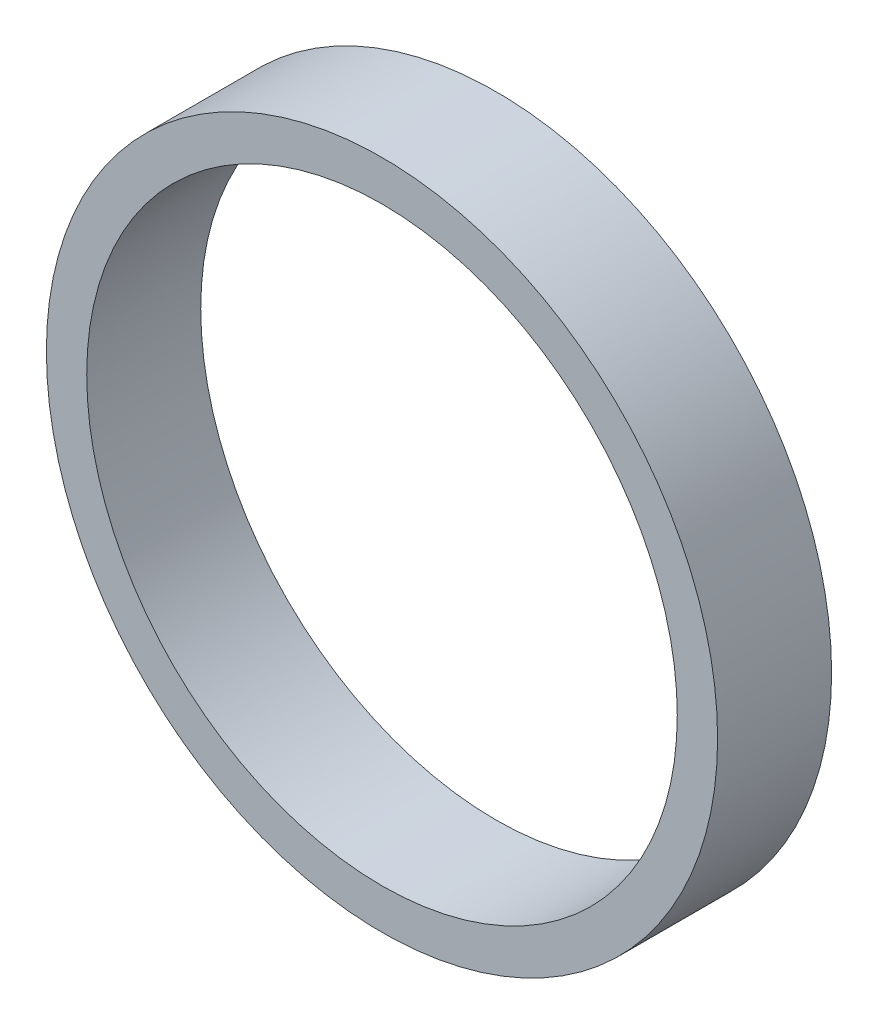
ISO-10303-21;
HEADER;
FILE_DESCRIPTION(('STEP AP214'),'2;1');
FILE_NAME('part.step','',(''),(''),'','','');
FILE_SCHEMA(('AUTOMOTIVE_DESIGN { 1 0 10303 214 1 1 1 1 }'));
ENDSEC;
DATA;
#1=APPLICATION_CONTEXT('core data for automotive mechanical design processes');
#2=APPLICATION_PROTOCOL_DEFINITION('international standard','automotive_design',2000,#1);
#3=PRODUCT_CONTEXT('',#1,'mechanical');
#4=PRODUCT('Part','Part','',(#3));
#5=PRODUCT_RELATED_PRODUCT_CATEGORY('part','',(#4));
#6=PRODUCT_DEFINITION_FORMATION('','',#4);
#7=PRODUCT_DEFINITION_CONTEXT('part definition',#1,'design');
#8=PRODUCT_DEFINITION('design','',#6,#7);
#9=PRODUCT_DEFINITION_SHAPE('','',#8);
#10=(LENGTH_UNIT() NAMED_UNIT(*) SI_UNIT(.MILLI.,.METRE.));
#11=(NAMED_UNIT(*) PLANE_ANGLE_UNIT() SI_UNIT($,.RADIAN.));
#12=(NAMED_UNIT(*) SI_UNIT($,.STERADIAN.) SOLID_ANGLE_UNIT());
#13=UNCERTAINTY_MEASURE_WITH_UNIT(LENGTH_MEASURE(1.E-05),#10,'distance_accuracy_value','');
#14=(GEOMETRIC_REPRESENTATION_CONTEXT(3) GLOBAL_UNCERTAINTY_ASSIGNED_CONTEXT((#13)) GLOBAL_UNIT_ASSIGNED_CONTEXT((#10,
#11,#12)) REPRESENTATION_CONTEXT('',''));
#15=CARTESIAN_POINT('',(0.,0.,0.));
#16=DIRECTION('',(0.,0.,1.));
#17=DIRECTION('',(1.,0.,0.));
#18=AXIS2_PLACEMENT_3D('',#15,#16,#17);
#19=CARTESIAN_POINT('',(0.,0.,-0.496944374939905));
#20=DIRECTION('',(0.,0.,1.));
#21=DIRECTION('',(1.,0.,0.));
#22=AXIS2_PLACEMENT_3D('',#19,#20,#21);
#23=CYLINDRICAL_SURFACE('',#22,2.92582417582417);
#24=CARTESIAN_POINT('',(0.,0.,-0.496944374939905));
#25=DIRECTION('',(0.,0.,1.));
#26=DIRECTION('',(1.,0.,0.));
#27=AXIS2_PLACEMENT_3D('',#24,#25,#26);
#28=CIRCLE('',#27,2.92582417582417);
#29=CARTESIAN_POINT('',(2.92582417582417,0.,-0.496944374939905));
#30=VERTEX_POINT('',#29);
#31=EDGE_CURVE('E10',#30,#30,#28,.T.);
#32=ORIENTED_EDGE('',*,*,#31,.T.);
#33=EDGE_LOOP('',(#32));
#34=FACE_BOUND('',#33,.T.);
#35=CARTESIAN_POINT('',(0.,0.,0.496944374939905));
#36=DIRECTION('',(0.,0.,1.));
#37=DIRECTION('',(1.,0.,0.));
#38=AXIS2_PLACEMENT_3D('',#35,#36,#37);
#39=CIRCLE('',#38,2.92582417582417);
#40=CARTESIAN_POINT('',(2.92582417582417,0.,0.496944374939905));
#41=VERTEX_POINT('',#40);
#42=EDGE_CURVE('E49',#41,#41,#39,.T.);
#43=ORIENTED_EDGE('',*,*,#42,.F.);
#44=EDGE_LOOP('',(#43));
#45=FACE_BOUND('',#44,.T.);
#46=ADVANCED_FACE('F35',(#34,#45),#23,.T.);
#47=CARTESIAN_POINT('',(2.92582417582417,0.,-0.496944374939905));
#48=DIRECTION('',(0.,0.,-1.));
#49=DIRECTION('',(-1.,0.,0.));
#50=AXIS2_PLACEMENT_3D('',#47,#48,#49);
#51=PLANE('',#50);
#52=CARTESIAN_POINT('',(0.,0.,-0.496944374939905));
#53=DIRECTION('',(0.,0.,1.));
#54=DIRECTION('',(1.,0.,0.));
#55=AXIS2_PLACEMENT_3D('',#52,#53,#54);
#56=CIRCLE('',#55,2.57417582417582);
#57=CARTESIAN_POINT('',(2.57417582417582,0.,-0.496944374939905));
#58=VERTEX_POINT('',#57);
#59=EDGE_CURVE('E41',#58,#58,#56,.T.);
#60=ORIENTED_EDGE('',*,*,#59,.T.);
#61=EDGE_LOOP('',(#60));
#62=FACE_BOUND('',#61,.T.);
#63=ORIENTED_EDGE('',*,*,#31,.F.);
#64=EDGE_LOOP('',(#63));
#65=FACE_BOUND('',#64,.T.);
#66=ADVANCED_FACE('F59',(#62,#65),#51,.T.);
#67=CARTESIAN_POINT('',(0.,0.,-0.496944374939905));
#68=DIRECTION('',(0.,0.,1.));
#69=DIRECTION('',(1.,0.,0.));
#70=AXIS2_PLACEMENT_3D('',#67,#68,#69);
#71=CYLINDRICAL_SURFACE('',#70,2.57417582417582);
#72=CARTESIAN_POINT('',(0.,0.,0.496944374939905));
#73=DIRECTION('',(0.,0.,1.));
#74=DIRECTION('',(1.,0.,0.));
#75=AXIS2_PLACEMENT_3D('',#72,#73,#74);
#76=CIRCLE('',#75,2.57417582417582);
#77=CARTESIAN_POINT('',(2.57417582417582,0.,0.496944374939905));
#78=VERTEX_POINT('',#77);
#79=EDGE_CURVE('E45',#78,#78,#76,.T.);
#80=ORIENTED_EDGE('',*,*,#79,.T.);
#81=EDGE_LOOP('',(#80));
#82=FACE_BOUND('',#81,.T.);
#83=ORIENTED_EDGE('',*,*,#59,.F.);
#84=EDGE_LOOP('',(#83));
#85=FACE_BOUND('',#84,.T.);
#86=ADVANCED_FACE('F63',(#82,#85),#71,.F.);
#87=CARTESIAN_POINT('',(2.57417582417582,0.,0.496944374939905));
#88=DIRECTION('',(0.,0.,1.));
#89=DIRECTION('',(1.,0.,0.));
#90=AXIS2_PLACEMENT_3D('',#87,#88,#89);
#91=PLANE('',#90);
#92=ORIENTED_EDGE('',*,*,#42,.T.);
#93=EDGE_LOOP('',(#92));
#94=FACE_BOUND('',#93,.T.);
#95=ORIENTED_EDGE('',*,*,#79,.F.);
#96=EDGE_LOOP('',(#95));
#97=FACE_BOUND('',#96,.T.);
#98=ADVANCED_FACE('F55',(#94,#97),#91,.T.);
#99=CLOSED_SHELL('',(#46,#66,#86,#98));
#100=MANIFOLD_SOLID_BREP('B2',#99);
#101=ADVANCED_BREP_SHAPE_REPRESENTATION('',(#18,#100),#14);
#102=SHAPE_DEFINITION_REPRESENTATION(#9,#101);
ENDSEC;
END-ISO-10303-21;
